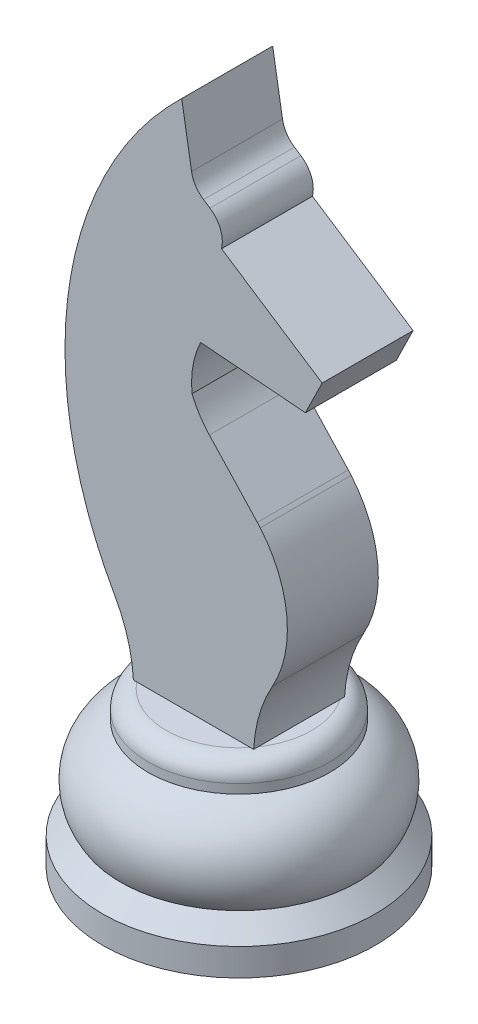
ISO-10303-21;
HEADER;
FILE_DESCRIPTION(('STEP AP214'),'2;1');
FILE_NAME('part.step','',(''),(''),'','','');
FILE_SCHEMA(('AUTOMOTIVE_DESIGN { 1 0 10303 214 1 1 1 1 }'));
ENDSEC;
DATA;
#1=APPLICATION_CONTEXT('core data for automotive mechanical design processes');
#2=APPLICATION_PROTOCOL_DEFINITION('international standard','automotive_design',2000,#1);
#3=PRODUCT_CONTEXT('',#1,'mechanical');
#4=PRODUCT('Part','Part','',(#3));
#5=PRODUCT_RELATED_PRODUCT_CATEGORY('part','',(#4));
#6=PRODUCT_DEFINITION_FORMATION('','',#4);
#7=PRODUCT_DEFINITION_CONTEXT('part definition',#1,'design');
#8=PRODUCT_DEFINITION('design','',#6,#7);
#9=PRODUCT_DEFINITION_SHAPE('','',#8);
#10=(LENGTH_UNIT() NAMED_UNIT(*) SI_UNIT(.MILLI.,.METRE.));
#11=(NAMED_UNIT(*) PLANE_ANGLE_UNIT() SI_UNIT($,.RADIAN.));
#12=(NAMED_UNIT(*) SI_UNIT($,.STERADIAN.) SOLID_ANGLE_UNIT());
#13=UNCERTAINTY_MEASURE_WITH_UNIT(LENGTH_MEASURE(1.E-05),#10,'distance_accuracy_value','');
#14=(GEOMETRIC_REPRESENTATION_CONTEXT(3) GLOBAL_UNCERTAINTY_ASSIGNED_CONTEXT((#13)) GLOBAL_UNIT_ASSIGNED_CONTEXT((#10,
#11,#12)) REPRESENTATION_CONTEXT('',''));
#15=CARTESIAN_POINT('',(0.,0.,0.));
#16=DIRECTION('',(0.,0.,1.));
#17=DIRECTION('',(1.,0.,0.));
#18=AXIS2_PLACEMENT_3D('',#15,#16,#17);
#19=CARTESIAN_POINT('',(-8.,16.97,0.));
#20=DIRECTION('',(0.,-1.,0.));
#21=DIRECTION('',(0.,0.,-1.));
#22=AXIS2_PLACEMENT_3D('',#19,#20,#21);
#23=PLANE('',#22);
#24=DIRECTION('',(0.,0.,-1.));
#25=VECTOR('',#24,1.);
#26=CARTESIAN_POINT('',(-6.61,16.97,5.));
#27=LINE('',#26,#25);
#28=CARTESIAN_POINT('',(-6.61,16.97,-4.50642874125398));
#29=VERTEX_POINT('',#28);
#30=CARTESIAN_POINT('',(-6.61,16.97,4.50642874125398));
#31=VERTEX_POINT('',#30);
#32=EDGE_CURVE('E202',#29,#31,#27,.F.);
#33=ORIENTED_EDGE('',*,*,#32,.F.);
#34=CARTESIAN_POINT('',(0.,16.97,0.));
#35=DIRECTION('',(0.,-1.,0.));
#36=DIRECTION('',(0.,0.,-1.));
#37=AXIS2_PLACEMENT_3D('',#34,#35,#36);
#38=CIRCLE('',#37,8.);
#39=EDGE_CURVE('E373',#31,#29,#38,.T.);
#40=ORIENTED_EDGE('',*,*,#39,.F.);
#41=EDGE_LOOP('',(#33,#40));
#42=FACE_BOUND('',#41,.T.);
#43=ADVANCED_FACE('F38',(#42),#23,.F.);
#44=DIRECTION('',(0.,0.,-1.));
#45=VECTOR('',#44,1.);
#46=CARTESIAN_POINT('',(6.60999999999988,16.97,5.));
#47=LINE('',#46,#45);
#48=CARTESIAN_POINT('',(6.60999999999988,16.97,4.50642874125416));
#49=VERTEX_POINT('',#48);
#50=CARTESIAN_POINT('',(6.60999999999988,16.97,-4.50642874125416));
#51=VERTEX_POINT('',#50);
#52=EDGE_CURVE('E247',#49,#51,#47,.T.);
#53=ORIENTED_EDGE('',*,*,#52,.F.);
#54=EDGE_CURVE('E220',#51,#49,#38,.T.);
#55=ORIENTED_EDGE('',*,*,#54,.F.);
#56=EDGE_LOOP('',(#53,#55));
#57=FACE_BOUND('',#56,.T.);
#58=ADVANCED_FACE('F484',(#57),#23,.F.);
#59=DIRECTION('',(-1.,0.,0.));
#60=VECTOR('',#59,1.);
#61=CARTESIAN_POINT('',(-8.,16.97,-5.));
#62=LINE('',#61,#60);
#63=CARTESIAN_POINT('',(6.2449979983984,16.97,-5.));
#64=VERTEX_POINT('',#63);
#65=CARTESIAN_POINT('',(-6.2449979983984,16.97,-5.));
#66=VERTEX_POINT('',#65);
#67=EDGE_CURVE('E240',#64,#66,#62,.T.);
#68=ORIENTED_EDGE('',*,*,#67,.F.);
#69=EDGE_CURVE('E204',#66,#64,#38,.T.);
#70=ORIENTED_EDGE('',*,*,#69,.F.);
#71=EDGE_LOOP('',(#68,#70));
#72=FACE_BOUND('',#71,.T.);
#73=ADVANCED_FACE('F384',(#72),#23,.F.);
#74=CARTESIAN_POINT('',(0.,0.,0.));
#75=DIRECTION('',(0.,1.,0.));
#76=DIRECTION('',(0.,0.,1.));
#77=AXIS2_PLACEMENT_3D('',#74,#75,#76);
#78=PLANE('',#77);
#79=CARTESIAN_POINT('',(0.,0.,0.));
#80=DIRECTION('',(0.,-1.,0.));
#81=DIRECTION('',(0.,0.,-1.));
#82=AXIS2_PLACEMENT_3D('',#79,#80,#81);
#83=CIRCLE('',#82,15.);
#84=CARTESIAN_POINT('',(0.,0.,-15.));
#85=VERTEX_POINT('',#84);
#86=EDGE_CURVE('E236',#85,#85,#83,.T.);
#87=ORIENTED_EDGE('',*,*,#86,.T.);
#88=EDGE_LOOP('',(#87));
#89=FACE_BOUND('',#88,.T.);
#90=ADVANCED_FACE('F506',(#89),#78,.F.);
#91=CARTESIAN_POINT('',(0.,0.,0.));
#92=DIRECTION('',(0.,-1.,0.));
#93=DIRECTION('',(0.,0.,-1.));
#94=AXIS2_PLACEMENT_3D('',#91,#92,#93);
#95=CYLINDRICAL_SURFACE('',#94,15.);
#96=ORIENTED_EDGE('',*,*,#86,.F.);
#97=EDGE_LOOP('',(#96));
#98=FACE_BOUND('',#97,.T.);
#99=CARTESIAN_POINT('',(0.,3.,0.));
#100=DIRECTION('',(0.,-1.,0.));
#101=DIRECTION('',(0.,0.,-1.));
#102=AXIS2_PLACEMENT_3D('',#99,#100,#101);
#103=CIRCLE('',#102,15.);
#104=CARTESIAN_POINT('',(0.,3.,-15.));
#105=VERTEX_POINT('',#104);
#106=EDGE_CURVE('E232',#105,#105,#103,.T.);
#107=ORIENTED_EDGE('',*,*,#106,.T.);
#108=EDGE_LOOP('',(#107));
#109=FACE_BOUND('',#108,.T.);
#110=ADVANCED_FACE('F510',(#98,#109),#95,.T.);
#111=CARTESIAN_POINT('',(0.,5.,0.));
#112=DIRECTION('',(0.,-1.,0.));
#113=DIRECTION('',(0.,0.,-1.));
#114=AXIS2_PLACEMENT_3D('',#111,#112,#113);
#115=CONICAL_SURFACE('',#114,13.,0.785398163397448);
#116=ORIENTED_EDGE('',*,*,#106,.F.);
#117=EDGE_LOOP('',(#116));
#118=FACE_BOUND('',#117,.T.);
#119=CARTESIAN_POINT('',(0.,5.,0.));
#120=DIRECTION('',(0.,-1.,0.));
#121=DIRECTION('',(0.,0.,-1.));
#122=AXIS2_PLACEMENT_3D('',#119,#120,#121);
#123=CIRCLE('',#122,13.);
#124=CARTESIAN_POINT('',(0.,5.,-13.));
#125=VERTEX_POINT('',#124);
#126=EDGE_CURVE('E228',#125,#125,#123,.T.);
#127=ORIENTED_EDGE('',*,*,#126,.T.);
#128=EDGE_LOOP('',(#127));
#129=FACE_BOUND('',#128,.T.);
#130=ADVANCED_FACE('F516',(#118,#129),#115,.T.);
#131=CARTESIAN_POINT('',(0.,8.31380661428568,0.));
#132=DIRECTION('',(0.,-1.,0.));
#133=DIRECTION('',(0.,0.,-1.));
#134=AXIS2_PLACEMENT_3D('',#131,#132,#133);
#135=TOROIDAL_SURFACE('',#134,7.99813177671418,6.);
#136=ORIENTED_EDGE('',*,*,#126,.F.);
#137=EDGE_LOOP('',(#136));
#138=FACE_BOUND('',#137,.T.);
#139=CARTESIAN_POINT('',(0.,13.97,0.));
#140=DIRECTION('',(0.,-1.,0.));
#141=DIRECTION('',(0.,0.,-1.));
#142=AXIS2_PLACEMENT_3D('',#139,#140,#141);
#143=CIRCLE('',#142,10.);
#144=CARTESIAN_POINT('',(0.,13.97,-10.));
#145=VERTEX_POINT('',#144);
#146=EDGE_CURVE('E224',#145,#145,#143,.T.);
#147=ORIENTED_EDGE('',*,*,#146,.T.);
#148=EDGE_LOOP('',(#147));
#149=FACE_BOUND('',#148,.T.);
#150=ADVANCED_FACE('F708',(#138,#149),#135,.T.);
#151=CARTESIAN_POINT('',(0.,0.,0.));
#152=DIRECTION('',(0.,-1.,0.));
#153=DIRECTION('',(0.,0.,-1.));
#154=AXIS2_PLACEMENT_3D('',#151,#152,#153);
#155=CYLINDRICAL_SURFACE('',#154,10.);
#156=ORIENTED_EDGE('',*,*,#146,.F.);
#157=EDGE_LOOP('',(#156));
#158=FACE_BOUND('',#157,.T.);
#159=CARTESIAN_POINT('',(0.,14.97,0.));
#160=DIRECTION('',(0.,-1.,0.));
#161=DIRECTION('',(0.,0.,-1.));
#162=AXIS2_PLACEMENT_3D('',#159,#160,#161);
#163=CIRCLE('',#162,10.);
#164=CARTESIAN_POINT('',(0.,14.97,-10.));
#165=VERTEX_POINT('',#164);
#166=EDGE_CURVE('E219',#165,#165,#163,.T.);
#167=ORIENTED_EDGE('',*,*,#166,.T.);
#168=EDGE_LOOP('',(#167));
#169=FACE_BOUND('',#168,.T.);
#170=ADVANCED_FACE('F503',(#158,#169),#155,.T.);
#171=CARTESIAN_POINT('',(0.,14.97,0.));
#172=DIRECTION('',(0.,-1.,0.));
#173=DIRECTION('',(0.,0.,-1.));
#174=AXIS2_PLACEMENT_3D('',#171,#172,#173);
#175=TOROIDAL_SURFACE('',#174,8.,2.);
#176=ORIENTED_EDGE('',*,*,#166,.F.);
#177=EDGE_LOOP('',(#176));
#178=FACE_BOUND('',#177,.T.);
#179=EDGE_CURVE('E212',#64,#51,#38,.T.);
#180=ORIENTED_EDGE('',*,*,#179,.T.);
#181=ORIENTED_EDGE('',*,*,#54,.T.);
#182=CARTESIAN_POINT('',(6.2449979983984,16.97,5.));
#183=VERTEX_POINT('',#182);
#184=EDGE_CURVE('E364',#49,#183,#38,.T.);
#185=ORIENTED_EDGE('',*,*,#184,.T.);
#186=CARTESIAN_POINT('',(-6.2449979983984,16.97,5.));
#187=VERTEX_POINT('',#186);
#188=EDGE_CURVE('E369',#183,#187,#38,.T.);
#189=ORIENTED_EDGE('',*,*,#188,.T.);
#190=EDGE_CURVE('E181',#187,#31,#38,.T.);
#191=ORIENTED_EDGE('',*,*,#190,.T.);
#192=ORIENTED_EDGE('',*,*,#39,.T.);
#193=EDGE_CURVE('E210',#29,#66,#38,.T.);
#194=ORIENTED_EDGE('',*,*,#193,.T.);
#195=ORIENTED_EDGE('',*,*,#69,.T.);
#196=EDGE_LOOP('',(#180,#181,#185,#189,#191,#192,#194,#195));
#197=FACE_BOUND('',#196,.T.);
#198=ADVANCED_FACE('F379',(#178,#197),#175,.T.);
#199=ORIENTED_EDGE('',*,*,#188,.F.);
#200=DIRECTION('',(-1.,0.,0.));
#201=VECTOR('',#200,1.);
#202=CARTESIAN_POINT('',(-8.,16.97,5.));
#203=LINE('',#202,#201);
#204=EDGE_CURVE('E244',#183,#187,#203,.T.);
#205=ORIENTED_EDGE('',*,*,#204,.T.);
#206=EDGE_LOOP('',(#199,#205));
#207=FACE_BOUND('',#206,.T.);
#208=ADVANCED_FACE('F487',(#207),#23,.F.);
#209=CARTESIAN_POINT('',(-6.61,16.97,5.));
#210=DIRECTION('',(0.,1.,0.));
#211=DIRECTION('',(-1.,0.,0.));
#212=AXIS2_PLACEMENT_3D('',#209,#210,#211);
#213=PLANE('',#212);
#214=ORIENTED_EDGE('',*,*,#179,.F.);
#215=DIRECTION('',(1.,0.,0.));
#216=VECTOR('',#215,1.);
#217=CARTESIAN_POINT('',(-6.61,16.97,-5.));
#218=LINE('',#217,#216);
#219=CARTESIAN_POINT('',(6.60999999999988,16.97,-5.));
#220=VERTEX_POINT('',#219);
#221=EDGE_CURVE('E390',#64,#220,#218,.T.);
#222=ORIENTED_EDGE('',*,*,#221,.T.);
#223=DIRECTION('',(0.,0.,-1.));
#224=VECTOR('',#223,1.);
#225=CARTESIAN_POINT('',(6.60999999999988,16.97,5.));
#226=LINE('',#225,#224);
#227=EDGE_CURVE('E344',#51,#220,#226,.T.);
#228=ORIENTED_EDGE('',*,*,#227,.F.);
#229=EDGE_LOOP('',(#214,#222,#228));
#230=FACE_BOUND('',#229,.T.);
#231=ADVANCED_FACE('F495',(#230),#213,.F.);
#232=ORIENTED_EDGE('',*,*,#184,.F.);
#233=CARTESIAN_POINT('',(6.60999999999988,16.97,5.));
#234=VERTEX_POINT('',#233);
#235=EDGE_CURVE('E213',#234,#49,#226,.T.);
#236=ORIENTED_EDGE('',*,*,#235,.F.);
#237=DIRECTION('',(1.,0.,0.));
#238=VECTOR('',#237,1.);
#239=CARTESIAN_POINT('',(-6.61,16.97,5.));
#240=LINE('',#239,#238);
#241=EDGE_CURVE('E185',#183,#234,#240,.T.);
#242=ORIENTED_EDGE('',*,*,#241,.F.);
#243=EDGE_LOOP('',(#232,#236,#242));
#244=FACE_BOUND('',#243,.T.);
#245=ADVANCED_FACE('F362',(#244),#213,.F.);
#246=ORIENTED_EDGE('',*,*,#190,.F.);
#247=CARTESIAN_POINT('',(-6.61,16.97,5.));
#248=VERTEX_POINT('',#247);
#249=EDGE_CURVE('E175',#248,#187,#240,.T.);
#250=ORIENTED_EDGE('',*,*,#249,.F.);
#251=DIRECTION('',(0.,0.,-1.));
#252=VECTOR('',#251,1.);
#253=CARTESIAN_POINT('',(-6.61,16.97,5.));
#254=LINE('',#253,#252);
#255=EDGE_CURVE('E179',#248,#31,#254,.T.);
#256=ORIENTED_EDGE('',*,*,#255,.T.);
#257=EDGE_LOOP('',(#246,#250,#256));
#258=FACE_BOUND('',#257,.T.);
#259=ADVANCED_FACE('F177',(#258),#213,.F.);
#260=CARTESIAN_POINT('',(-22.6266432968998,16.1047038080094,5.));
#261=DIRECTION('',(0.,0.,-1.));
#262=DIRECTION('',(-1.,0.,0.));
#263=AXIS2_PLACEMENT_3D('',#260,#261,#262);
#264=CYLINDRICAL_SURFACE('',#263,16.04);
#265=CARTESIAN_POINT('',(-22.6266432968998,16.1047038080094,-5.));
#266=DIRECTION('',(0.,0.,-1.));
#267=DIRECTION('',(1.,0.,0.));
#268=AXIS2_PLACEMENT_3D('',#265,#266,#267);
#269=CIRCLE('',#268,16.04);
#270=CARTESIAN_POINT('',(-8.67,24.01,-5.));
#271=VERTEX_POINT('',#270);
#272=CARTESIAN_POINT('',(-6.61,16.97,-5.));
#273=VERTEX_POINT('',#272);
#274=EDGE_CURVE('E301',#271,#273,#269,.T.);
#275=ORIENTED_EDGE('',*,*,#274,.T.);
#276=EDGE_CURVE('E205',#29,#273,#254,.T.);
#277=ORIENTED_EDGE('',*,*,#276,.F.);
#278=ORIENTED_EDGE('',*,*,#32,.T.);
#279=ORIENTED_EDGE('',*,*,#255,.F.);
#280=CARTESIAN_POINT('',(-22.6266432968998,16.1047038080094,5.));
#281=DIRECTION('',(0.,0.,-1.));
#282=DIRECTION('',(1.,0.,0.));
#283=AXIS2_PLACEMENT_3D('',#280,#281,#282);
#284=CIRCLE('',#283,16.04);
#285=CARTESIAN_POINT('',(-8.67,24.01,5.));
#286=VERTEX_POINT('',#285);
#287=EDGE_CURVE('E188',#286,#248,#284,.T.);
#288=ORIENTED_EDGE('',*,*,#287,.F.);
#289=DIRECTION('',(0.,0.,-1.));
#290=VECTOR('',#289,1.);
#291=CARTESIAN_POINT('',(-8.67,24.01,5.));
#292=LINE('',#291,#290);
#293=EDGE_CURVE('E331',#286,#271,#292,.T.);
#294=ORIENTED_EDGE('',*,*,#293,.T.);
#295=EDGE_LOOP('',(#275,#277,#278,#279,#288,#294));
#296=FACE_BOUND('',#295,.T.);
#297=ADVANCED_FACE('F200',(#296),#264,.F.);
#298=ORIENTED_EDGE('',*,*,#193,.F.);
#299=ORIENTED_EDGE('',*,*,#276,.T.);
#300=EDGE_CURVE('E388',#273,#66,#218,.T.);
#301=ORIENTED_EDGE('',*,*,#300,.T.);
#302=EDGE_LOOP('',(#298,#299,#301));
#303=FACE_BOUND('',#302,.T.);
#304=ADVANCED_FACE('F391',(#303),#213,.F.);
#305=CARTESIAN_POINT('',(22.6266432968997,16.1047038080096,5.));
#306=DIRECTION('',(0.,0.,-1.));
#307=DIRECTION('',(-1.,0.,0.));
#308=AXIS2_PLACEMENT_3D('',#305,#306,#307);
#309=CYLINDRICAL_SURFACE('',#308,16.04);
#310=CARTESIAN_POINT('',(22.6266432968997,16.1047038080096,-5.));
#311=DIRECTION('',(0.,0.,-1.));
#312=DIRECTION('',(-1.,0.,0.));
#313=AXIS2_PLACEMENT_3D('',#310,#311,#312);
#314=CIRCLE('',#313,16.04);
#315=CARTESIAN_POINT('',(8.66999999999983,24.0100000000001,-5.));
#316=VERTEX_POINT('',#315);
#317=EDGE_CURVE('E393',#220,#316,#314,.T.);
#318=ORIENTED_EDGE('',*,*,#317,.T.);
#319=DIRECTION('',(0.,0.,-1.));
#320=VECTOR('',#319,1.);
#321=CARTESIAN_POINT('',(8.66999999999983,24.0100000000001,5.));
#322=LINE('',#321,#320);
#323=CARTESIAN_POINT('',(8.66999999999983,24.0100000000001,5.));
#324=VERTEX_POINT('',#323);
#325=EDGE_CURVE('E341',#324,#316,#322,.T.);
#326=ORIENTED_EDGE('',*,*,#325,.F.);
#327=CARTESIAN_POINT('',(22.6266432968997,16.1047038080096,5.));
#328=DIRECTION('',(0.,0.,-1.));
#329=DIRECTION('',(-1.,0.,0.));
#330=AXIS2_PLACEMENT_3D('',#327,#328,#329);
#331=CIRCLE('',#330,16.04);
#332=EDGE_CURVE('E184',#234,#324,#331,.T.);
#333=ORIENTED_EDGE('',*,*,#332,.F.);
#334=ORIENTED_EDGE('',*,*,#235,.T.);
#335=ORIENTED_EDGE('',*,*,#52,.T.);
#336=ORIENTED_EDGE('',*,*,#227,.T.);
#337=EDGE_LOOP('',(#318,#326,#333,#334,#335,#336));
#338=FACE_BOUND('',#337,.T.);
#339=ADVANCED_FACE('F358',(#338),#309,.F.);
#340=CARTESIAN_POINT('',(-2.36195303089741,30.2612728563128,5.));
#341=DIRECTION('',(0.,0.,-1.));
#342=DIRECTION('',(-1.,0.,0.));
#343=AXIS2_PLACEMENT_3D('',#340,#341,#342);
#344=CYLINDRICAL_SURFACE('',#343,12.6799999999999);
#345=CARTESIAN_POINT('',(-2.36195303089741,30.2612728563128,-5.));
#346=DIRECTION('',(0.,0.,1.));
#347=DIRECTION('',(-1.,0.,0.));
#348=AXIS2_PLACEMENT_3D('',#345,#346,#347);
#349=CIRCLE('',#348,12.6799999999999);
#350=CARTESIAN_POINT('',(7.3359892790115,38.4302577965411,-5.));
#351=VERTEX_POINT('',#350);
#352=EDGE_CURVE('E397',#316,#351,#349,.T.);
#353=ORIENTED_EDGE('',*,*,#352,.T.);
#354=DIRECTION('',(0.,0.,-1.));
#355=VECTOR('',#354,1.);
#356=CARTESIAN_POINT('',(7.3359892790115,38.4302577965411,5.));
#357=LINE('',#356,#355);
#358=CARTESIAN_POINT('',(7.3359892790115,38.4302577965411,5.));
#359=VERTEX_POINT('',#358);
#360=EDGE_CURVE('E278',#351,#359,#357,.F.);
#361=ORIENTED_EDGE('',*,*,#360,.T.);
#362=CARTESIAN_POINT('',(-2.36195303089741,30.2612728563128,5.));
#363=DIRECTION('',(0.,0.,1.));
#364=DIRECTION('',(-1.,0.,0.));
#365=AXIS2_PLACEMENT_3D('',#362,#363,#364);
#366=CIRCLE('',#365,12.6799999999999);
#367=EDGE_CURVE('E441',#324,#359,#366,.T.);
#368=ORIENTED_EDGE('',*,*,#367,.F.);
#369=ORIENTED_EDGE('',*,*,#325,.T.);
#370=EDGE_LOOP('',(#353,#361,#368,#369));
#371=FACE_BOUND('',#370,.T.);
#372=ADVANCED_FACE('F447',(#371),#344,.T.);
#373=CARTESIAN_POINT('',(0.,46.35,5.));
#374=DIRECTION('',(-0.732895581670668,-0.680341139699499,0.));
#375=DIRECTION('',(0.680341139699499,-0.732895581670668,0.));
#376=AXIS2_PLACEMENT_3D('',#373,#374,#375);
#377=PLANE('',#376);
#378=DIRECTION('',(-0.680341139699499,0.732895581670668,0.));
#379=VECTOR('',#378,1.);
#380=CARTESIAN_POINT('',(0.,46.35,-5.));
#381=LINE('',#380,#379);
#382=CARTESIAN_POINT('',(7.01672560840826,38.7912520482456,-5.));
#383=VERTEX_POINT('',#382);
#384=CARTESIAN_POINT('',(1.74253125192974,44.4728631036094,-5.));
#385=VERTEX_POINT('',#384);
#386=EDGE_CURVE('E404',#383,#385,#381,.T.);
#387=ORIENTED_EDGE('',*,*,#386,.T.);
#388=DIRECTION('',(0.,0.,-1.));
#389=VECTOR('',#388,1.);
#390=CARTESIAN_POINT('',(1.74253125192974,44.4728631036094,5.));
#391=LINE('',#390,#389);
#392=CARTESIAN_POINT('',(1.74253125192974,44.4728631036094,5.));
#393=VERTEX_POINT('',#392);
#394=EDGE_CURVE('E272',#385,#393,#391,.F.);
#395=ORIENTED_EDGE('',*,*,#394,.T.);
#396=DIRECTION('',(-0.680341139699499,0.732895581670668,0.));
#397=VECTOR('',#396,1.);
#398=CARTESIAN_POINT('',(0.,46.35,5.));
#399=LINE('',#398,#397);
#400=CARTESIAN_POINT('',(7.01672560840826,38.7912520482456,5.));
#401=VERTEX_POINT('',#400);
#402=EDGE_CURVE('E437',#401,#393,#399,.T.);
#403=ORIENTED_EDGE('',*,*,#402,.F.);
#404=DIRECTION('',(0.,0.,-1.));
#405=VECTOR('',#404,1.);
#406=CARTESIAN_POINT('',(7.01672560840826,38.7912520482456,5.));
#407=LINE('',#406,#405);
#408=EDGE_CURVE('E268',#401,#383,#407,.T.);
#409=ORIENTED_EDGE('',*,*,#408,.T.);
#410=EDGE_LOOP('',(#387,#395,#403,#409));
#411=FACE_BOUND('',#410,.T.);
#412=ADVANCED_FACE('F455',(#411),#377,.F.);
#413=CARTESIAN_POINT('',(12.3,51.87,5.));
#414=DIRECTION('',(0.0813269296982187,0.996687478854762,0.));
#415=DIRECTION('',(-0.996687478854762,0.0813269296982187,0.));
#416=AXIS2_PLACEMENT_3D('',#413,#414,#415);
#417=PLANE('',#416);
#418=DIRECTION('',(0.996687478854762,-0.0813269296982187,0.));
#419=VECTOR('',#418,1.);
#420=CARTESIAN_POINT('',(12.3,51.87,-5.));
#421=LINE('',#420,#419);
#422=CARTESIAN_POINT('',(0.78,52.81,-5.));
#423=VERTEX_POINT('',#422);
#424=CARTESIAN_POINT('',(12.3,51.87,-5.));
#425=VERTEX_POINT('',#424);
#426=EDGE_CURVE('E408',#423,#425,#421,.T.);
#427=ORIENTED_EDGE('',*,*,#426,.T.);
#428=DIRECTION('',(0.,0.,-1.));
#429=VECTOR('',#428,1.);
#430=CARTESIAN_POINT('',(12.3,51.87,5.));
#431=LINE('',#430,#429);
#432=CARTESIAN_POINT('',(12.3,51.87,5.));
#433=VERTEX_POINT('',#432);
#434=EDGE_CURVE('E328',#433,#425,#431,.T.);
#435=ORIENTED_EDGE('',*,*,#434,.F.);
#436=DIRECTION('',(0.996687478854762,-0.0813269296982187,0.));
#437=VECTOR('',#436,1.);
#438=CARTESIAN_POINT('',(12.3,51.87,5.));
#439=LINE('',#438,#437);
#440=CARTESIAN_POINT('',(0.78,52.81,5.));
#441=VERTEX_POINT('',#440);
#442=EDGE_CURVE('E434',#441,#433,#439,.T.);
#443=ORIENTED_EDGE('',*,*,#442,.F.);
#444=DIRECTION('',(0.,0.,-1.));
#445=VECTOR('',#444,1.);
#446=CARTESIAN_POINT('',(0.78,52.81,5.));
#447=LINE('',#446,#445);
#448=EDGE_CURVE('E338',#441,#423,#447,.T.);
#449=ORIENTED_EDGE('',*,*,#448,.T.);
#450=EDGE_LOOP('',(#427,#435,#443,#449));
#451=FACE_BOUND('',#450,.T.);
#452=ADVANCED_FACE('F468',(#451),#417,.F.);
#453=CARTESIAN_POINT('',(14.14,55.62,5.));
#454=DIRECTION('',(-0.897753685952581,0.440497808574067,0.));
#455=DIRECTION('',(-0.440497808574067,-0.897753685952581,0.));
#456=AXIS2_PLACEMENT_3D('',#453,#454,#455);
#457=PLANE('',#456);
#458=DIRECTION('',(0.440497808574067,0.897753685952581,0.));
#459=VECTOR('',#458,1.);
#460=CARTESIAN_POINT('',(14.14,55.62,-5.));
#461=LINE('',#460,#459);
#462=CARTESIAN_POINT('',(14.14,55.62,-5.));
#463=VERTEX_POINT('',#462);
#464=EDGE_CURVE('E321',#425,#463,#461,.T.);
#465=ORIENTED_EDGE('',*,*,#464,.T.);
#466=DIRECTION('',(0.,0.,-1.));
#467=VECTOR('',#466,1.);
#468=CARTESIAN_POINT('',(14.14,55.62,5.));
#469=LINE('',#468,#467);
#470=CARTESIAN_POINT('',(14.14,55.62,5.));
#471=VERTEX_POINT('',#470);
#472=EDGE_CURVE('E319',#471,#463,#469,.T.);
#473=ORIENTED_EDGE('',*,*,#472,.F.);
#474=DIRECTION('',(0.440497808574067,0.897753685952581,0.));
#475=VECTOR('',#474,1.);
#476=CARTESIAN_POINT('',(14.14,55.62,5.));
#477=LINE('',#476,#475);
#478=EDGE_CURVE('E431',#433,#471,#477,.T.);
#479=ORIENTED_EDGE('',*,*,#478,.F.);
#480=ORIENTED_EDGE('',*,*,#434,.T.);
#481=EDGE_LOOP('',(#465,#473,#479,#480));
#482=FACE_BOUND('',#481,.T.);
#483=ADVANCED_FACE('F473',(#482),#457,.F.);
#484=CARTESIAN_POINT('',(3.08,62.88,5.));
#485=DIRECTION('',(-0.548755499356447,-0.835982895713816,0.));
#486=DIRECTION('',(0.835982895713816,-0.548755499356447,0.));
#487=AXIS2_PLACEMENT_3D('',#484,#485,#486);
#488=PLANE('',#487);
#489=DIRECTION('',(-0.835982895713816,0.548755499356447,0.));
#490=VECTOR('',#489,1.);
#491=CARTESIAN_POINT('',(3.08,62.88,-5.));
#492=LINE('',#491,#490);
#493=CARTESIAN_POINT('',(3.08,62.88,-5.));
#494=VERTEX_POINT('',#493);
#495=EDGE_CURVE('E310',#463,#494,#492,.T.);
#496=ORIENTED_EDGE('',*,*,#495,.T.);
#497=DIRECTION('',(0.,0.,-1.));
#498=VECTOR('',#497,1.);
#499=CARTESIAN_POINT('',(3.08,62.88,5.));
#500=LINE('',#499,#498);
#501=CARTESIAN_POINT('',(3.08,62.88,5.));
#502=VERTEX_POINT('',#501);
#503=EDGE_CURVE('E317',#502,#494,#500,.T.);
#504=ORIENTED_EDGE('',*,*,#503,.F.);
#505=DIRECTION('',(-0.835982895713816,0.548755499356447,0.));
#506=VECTOR('',#505,1.);
#507=CARTESIAN_POINT('',(3.08,62.88,5.));
#508=LINE('',#507,#506);
#509=EDGE_CURVE('E428',#471,#502,#508,.T.);
#510=ORIENTED_EDGE('',*,*,#509,.F.);
#511=ORIENTED_EDGE('',*,*,#472,.T.);
#512=EDGE_LOOP('',(#496,#504,#510,#511));
#513=FACE_BOUND('',#512,.T.);
#514=ADVANCED_FACE('F315',(#513),#488,.F.);
#515=CARTESIAN_POINT('',(0.,67.29,5.));
#516=DIRECTION('',(-0.54681755660123,-0.837251789960858,0.));
#517=DIRECTION('',(0.837251789960858,-0.54681755660123,0.));
#518=AXIS2_PLACEMENT_3D('',#515,#516,#517);
#519=PLANE('',#518);
#520=DIRECTION('',(-0.837251789960858,0.54681755660123,0.));
#521=VECTOR('',#520,1.);
#522=CARTESIAN_POINT('',(0.,67.29,5.));
#523=LINE('',#522,#521);
#524=CARTESIAN_POINT('',(1.80756738703669,66.109459577366,5.));
#525=VERTEX_POINT('',#524);
#526=CARTESIAN_POINT('',(1.10029367005231,66.5713871485065,5.));
#527=VERTEX_POINT('',#526);
#528=EDGE_CURVE('E423',#525,#527,#523,.T.);
#529=ORIENTED_EDGE('',*,*,#528,.F.);
#530=DIRECTION('',(0.,0.,1.));
#531=VECTOR('',#530,1.);
#532=CARTESIAN_POINT('',(1.80756738703669,66.109459577366,5.));
#533=LINE('',#532,#531);
#534=CARTESIAN_POINT('',(1.80756738703669,66.109459577366,-5.));
#535=VERTEX_POINT('',#534);
#536=EDGE_CURVE('E296',#525,#535,#533,.F.);
#537=ORIENTED_EDGE('',*,*,#536,.T.);
#538=DIRECTION('',(-0.837251789960858,0.54681755660123,0.));
#539=VECTOR('',#538,1.);
#540=CARTESIAN_POINT('',(0.,67.29,-5.));
#541=LINE('',#540,#539);
#542=CARTESIAN_POINT('',(1.10029367005231,66.5713871485065,-5.));
#543=VERTEX_POINT('',#542);
#544=EDGE_CURVE('E311',#535,#543,#541,.T.);
#545=ORIENTED_EDGE('',*,*,#544,.T.);
#546=DIRECTION('',(0.,0.,-1.));
#547=VECTOR('',#546,1.);
#548=CARTESIAN_POINT('',(1.10029367005231,66.5713871485065,5.));
#549=LINE('',#548,#547);
#550=EDGE_CURVE('E257',#543,#527,#549,.F.);
#551=ORIENTED_EDGE('',*,*,#550,.T.);
#552=EDGE_LOOP('',(#529,#537,#545,#551));
#553=FACE_BOUND('',#552,.T.);
#554=ADVANCED_FACE('F480',(#553),#519,.F.);
#555=CARTESIAN_POINT('',(-1.29556040883868,75.,5.));
#556=DIRECTION('',(-0.986174005255483,-0.165713099537598,0.));
#557=DIRECTION('',(0.165713099537598,-0.986174005255483,0.));
#558=AXIS2_PLACEMENT_3D('',#555,#556,#557);
#559=PLANE('',#558);
#560=DIRECTION('',(-0.165713099537598,0.986174005255483,0.));
#561=VECTOR('',#560,1.);
#562=CARTESIAN_POINT('',(-1.29556040883868,75.,5.));
#563=LINE('',#562,#561);
#564=CARTESIAN_POINT('',(-0.217775675910456,68.5860032197763,5.));
#565=VERTEX_POINT('',#564);
#566=CARTESIAN_POINT('',(-1.29556040883868,75.,5.));
#567=VERTEX_POINT('',#566);
#568=EDGE_CURVE('E421',#565,#567,#563,.T.);
#569=ORIENTED_EDGE('',*,*,#568,.F.);
#570=DIRECTION('',(0.,0.,-1.));
#571=VECTOR('',#570,1.);
#572=CARTESIAN_POINT('',(-0.217775675910458,68.5860032197763,-5.));
#573=LINE('',#572,#571);
#574=CARTESIAN_POINT('',(-0.217775675910456,68.5860032197763,-5.));
#575=VERTEX_POINT('',#574);
#576=EDGE_CURVE('E253',#565,#575,#573,.T.);
#577=ORIENTED_EDGE('',*,*,#576,.T.);
#578=DIRECTION('',(-0.165713099537598,0.986174005255483,0.));
#579=VECTOR('',#578,1.);
#580=CARTESIAN_POINT('',(-1.29556040883868,75.,-5.));
#581=LINE('',#580,#579);
#582=CARTESIAN_POINT('',(-1.29556040883868,75.,-5.));
#583=VERTEX_POINT('',#582);
#584=EDGE_CURVE('E415',#575,#583,#581,.T.);
#585=ORIENTED_EDGE('',*,*,#584,.T.);
#586=DIRECTION('',(0.,0.,-1.));
#587=VECTOR('',#586,1.);
#588=CARTESIAN_POINT('',(-1.29556040883868,75.,5.));
#589=LINE('',#588,#587);
#590=EDGE_CURVE('E324',#567,#583,#589,.T.);
#591=ORIENTED_EDGE('',*,*,#590,.F.);
#592=EDGE_LOOP('',(#569,#577,#585,#591));
#593=FACE_BOUND('',#592,.T.);
#594=ADVANCED_FACE('F564',(#593),#559,.F.);
#595=CARTESIAN_POINT('',(27.9357346322055,44.7441527928331,5.));
#596=DIRECTION('',(0.,0.,-1.));
#597=DIRECTION('',(-1.,0.,0.));
#598=AXIS2_PLACEMENT_3D('',#595,#596,#597);
#599=CYLINDRICAL_SURFACE('',#598,42.07);
#600=CARTESIAN_POINT('',(27.9357346322055,44.7441527928331,-5.));
#601=DIRECTION('',(0.,0.,1.));
#602=DIRECTION('',(-1.,0.,0.));
#603=AXIS2_PLACEMENT_3D('',#600,#601,#602);
#604=CIRCLE('',#603,42.07);
#605=EDGE_CURVE('E196',#583,#271,#604,.T.);
#606=ORIENTED_EDGE('',*,*,#605,.T.);
#607=ORIENTED_EDGE('',*,*,#293,.F.);
#608=CARTESIAN_POINT('',(27.9357346322055,44.7441527928331,5.));
#609=DIRECTION('',(0.,0.,1.));
#610=DIRECTION('',(-1.,0.,0.));
#611=AXIS2_PLACEMENT_3D('',#608,#609,#610);
#612=CIRCLE('',#611,42.07);
#613=EDGE_CURVE('E191',#567,#286,#612,.T.);
#614=ORIENTED_EDGE('',*,*,#613,.F.);
#615=ORIENTED_EDGE('',*,*,#590,.T.);
#616=EDGE_LOOP('',(#606,#607,#614,#615));
#617=FACE_BOUND('',#616,.T.);
#618=ADVANCED_FACE('F553',(#617),#599,.T.);
#619=CARTESIAN_POINT('',(-22.6266432968998,16.1047038080094,5.));
#620=DIRECTION('',(0.,0.,1.));
#621=DIRECTION('',(1.,0.,0.));
#622=AXIS2_PLACEMENT_3D('',#619,#620,#621);
#623=PLANE('',#622);
#624=ORIENTED_EDGE('',*,*,#509,.T.);
#625=CARTESIAN_POINT('',(0.167114717233001,63.5977042074834,5.));
#626=DIRECTION('',(0.,0.,1.));
#627=DIRECTION('',(1.,0.,0.));
#628=AXIS2_PLACEMENT_3D('',#625,#626,#627);
#629=CIRCLE('',#628,3.);
#630=EDGE_CURVE('E11',#502,#525,#629,.T.);
#631=ORIENTED_EDGE('',*,*,#630,.T.);
#632=ORIENTED_EDGE('',*,*,#528,.T.);
#633=CARTESIAN_POINT('',(2.74074633985599,69.0831425183891,5.));
#634=DIRECTION('',(0.,0.,1.));
#635=DIRECTION('',(1.,0.,0.));
#636=AXIS2_PLACEMENT_3D('',#633,#634,#635);
#637=CIRCLE('',#636,3.);
#638=EDGE_CURVE('E265',#527,#565,#637,.F.);
#639=ORIENTED_EDGE('',*,*,#638,.T.);
#640=ORIENTED_EDGE('',*,*,#568,.T.);
#641=ORIENTED_EDGE('',*,*,#613,.T.);
#642=ORIENTED_EDGE('',*,*,#287,.T.);
#643=ORIENTED_EDGE('',*,*,#249,.T.);
#644=ORIENTED_EDGE('',*,*,#204,.F.);
#645=ORIENTED_EDGE('',*,*,#241,.T.);
#646=ORIENTED_EDGE('',*,*,#332,.T.);
#647=ORIENTED_EDGE('',*,*,#367,.T.);
#648=CARTESIAN_POINT('',(-0.312230208298423,31.9878406512506,5.));
#649=DIRECTION('',(0.,0.,1.));
#650=DIRECTION('',(1.,0.,0.));
#651=AXIS2_PLACEMENT_3D('',#648,#649,#650);
#652=CIRCLE('',#651,10.);
#653=EDGE_CURVE('E281',#359,#401,#652,.T.);
#654=ORIENTED_EDGE('',*,*,#653,.T.);
#655=ORIENTED_EDGE('',*,*,#402,.T.);
#656=CARTESIAN_POINT('',(9.07148706863643,51.2762745006044,5.));
#657=DIRECTION('',(0.,0.,1.));
#658=DIRECTION('',(1.,0.,0.));
#659=AXIS2_PLACEMENT_3D('',#656,#657,#658);
#660=CIRCLE('',#659,10.);
#661=CARTESIAN_POINT('',(-0.167203870802131,47.4491881773637,5.));
#662=VERTEX_POINT('',#661);
#663=EDGE_CURVE('E293',#393,#662,#660,.F.);
#664=ORIENTED_EDGE('',*,*,#663,.T.);
#665=CARTESIAN_POINT('',(9.78205055434745,48.4553374623316,5.));
#666=DIRECTION('',(0.,0.,1.));
#667=DIRECTION('',(1.,0.,0.));
#668=AXIS2_PLACEMENT_3D('',#665,#666,#667);
#669=CIRCLE('',#668,10.);
#670=EDGE_CURVE('E287',#662,#441,#669,.F.);
#671=ORIENTED_EDGE('',*,*,#670,.T.);
#672=ORIENTED_EDGE('',*,*,#442,.T.);
#673=ORIENTED_EDGE('',*,*,#478,.T.);
#674=EDGE_LOOP('',(#624,#631,#632,#639,#640,#641,#642,#643,#644,#645,#646,#647,#654,#655,#664,
#671,#672,#673));
#675=FACE_BOUND('',#674,.T.);
#676=ADVANCED_FACE('F189',(#675),#623,.T.);
#677=CARTESIAN_POINT('',(-22.6266432968998,16.1047038080094,-5.));
#678=DIRECTION('',(0.,0.,1.));
#679=DIRECTION('',(1.,0.,0.));
#680=AXIS2_PLACEMENT_3D('',#677,#678,#679);
#681=PLANE('',#680);
#682=ORIENTED_EDGE('',*,*,#544,.F.);
#683=CARTESIAN_POINT('',(0.167114717233001,63.5977042074834,-5.));
#684=DIRECTION('',(0.,0.,1.));
#685=DIRECTION('',(1.,0.,0.));
#686=AXIS2_PLACEMENT_3D('',#683,#684,#685);
#687=CIRCLE('',#686,3.);
#688=EDGE_CURVE('E47',#535,#494,#687,.F.);
#689=ORIENTED_EDGE('',*,*,#688,.T.);
#690=ORIENTED_EDGE('',*,*,#495,.F.);
#691=ORIENTED_EDGE('',*,*,#464,.F.);
#692=ORIENTED_EDGE('',*,*,#426,.F.);
#693=CARTESIAN_POINT('',(9.78205055434745,48.4553374623316,-5.));
#694=DIRECTION('',(0.,0.,1.));
#695=DIRECTION('',(1.,0.,0.));
#696=AXIS2_PLACEMENT_3D('',#693,#694,#695);
#697=CIRCLE('',#696,10.);
#698=CARTESIAN_POINT('',(-0.167203870802131,47.4491881773637,-5.));
#699=VERTEX_POINT('',#698);
#700=EDGE_CURVE('E284',#423,#699,#697,.T.);
#701=ORIENTED_EDGE('',*,*,#700,.T.);
#702=CARTESIAN_POINT('',(9.07148706863643,51.2762745006044,-5.));
#703=DIRECTION('',(0.,0.,1.));
#704=DIRECTION('',(1.,0.,0.));
#705=AXIS2_PLACEMENT_3D('',#702,#703,#704);
#706=CIRCLE('',#705,10.);
#707=EDGE_CURVE('E290',#699,#385,#706,.T.);
#708=ORIENTED_EDGE('',*,*,#707,.T.);
#709=ORIENTED_EDGE('',*,*,#386,.F.);
#710=CARTESIAN_POINT('',(-0.312230208298423,31.9878406512506,-5.));
#711=DIRECTION('',(0.,0.,1.));
#712=DIRECTION('',(1.,0.,0.));
#713=AXIS2_PLACEMENT_3D('',#710,#711,#712);
#714=CIRCLE('',#713,10.);
#715=EDGE_CURVE('E275',#383,#351,#714,.F.);
#716=ORIENTED_EDGE('',*,*,#715,.T.);
#717=ORIENTED_EDGE('',*,*,#352,.F.);
#718=ORIENTED_EDGE('',*,*,#317,.F.);
#719=ORIENTED_EDGE('',*,*,#221,.F.);
#720=ORIENTED_EDGE('',*,*,#67,.T.);
#721=ORIENTED_EDGE('',*,*,#300,.F.);
#722=ORIENTED_EDGE('',*,*,#274,.F.);
#723=ORIENTED_EDGE('',*,*,#605,.F.);
#724=ORIENTED_EDGE('',*,*,#584,.F.);
#725=CARTESIAN_POINT('',(2.74074633985599,69.0831425183891,-5.));
#726=DIRECTION('',(0.,0.,1.));
#727=DIRECTION('',(1.,0.,0.));
#728=AXIS2_PLACEMENT_3D('',#725,#726,#727);
#729=CIRCLE('',#728,3.);
#730=EDGE_CURVE('E261',#575,#543,#729,.T.);
#731=ORIENTED_EDGE('',*,*,#730,.T.);
#732=EDGE_LOOP('',(#682,#689,#690,#691,#692,#701,#708,#709,#716,#717,#718,#719,#720,#721,#722,
#723,#724,#731));
#733=FACE_BOUND('',#732,.T.);
#734=ADVANCED_FACE('F308',(#733),#681,.F.);
#735=CARTESIAN_POINT('',(2.74074633985599,69.0831425183891,5.));
#736=DIRECTION('',(0.,0.,1.));
#737=DIRECTION('',(1.,0.,0.));
#738=AXIS2_PLACEMENT_3D('',#735,#736,#737);
#739=CYLINDRICAL_SURFACE('',#738,3.);
#740=ORIENTED_EDGE('',*,*,#638,.F.);
#741=ORIENTED_EDGE('',*,*,#550,.F.);
#742=ORIENTED_EDGE('',*,*,#730,.F.);
#743=ORIENTED_EDGE('',*,*,#576,.F.);
#744=EDGE_LOOP('',(#740,#741,#742,#743));
#745=FACE_BOUND('',#744,.T.);
#746=ADVANCED_FACE('F521',(#745),#739,.F.);
#747=CARTESIAN_POINT('',(9.07148706863643,51.2762745006044,5.));
#748=DIRECTION('',(0.,0.,1.));
#749=DIRECTION('',(1.,0.,0.));
#750=AXIS2_PLACEMENT_3D('',#747,#748,#749);
#751=CYLINDRICAL_SURFACE('',#750,10.);
#752=DIRECTION('',(0.,0.,1.));
#753=VECTOR('',#752,1.);
#754=CARTESIAN_POINT('',(-0.167203870802131,47.4491881773637,0.));
#755=LINE('',#754,#753);
#756=EDGE_CURVE('E297',#662,#699,#755,.F.);
#757=ORIENTED_EDGE('',*,*,#756,.F.);
#758=ORIENTED_EDGE('',*,*,#663,.F.);
#759=ORIENTED_EDGE('',*,*,#394,.F.);
#760=ORIENTED_EDGE('',*,*,#707,.F.);
#761=EDGE_LOOP('',(#757,#758,#759,#760));
#762=FACE_BOUND('',#761,.T.);
#763=ADVANCED_FACE('F461',(#762),#751,.F.);
#764=CARTESIAN_POINT('',(9.78205055434745,48.4553374623316,5.));
#765=DIRECTION('',(0.,0.,-1.));
#766=DIRECTION('',(-1.,0.,0.));
#767=AXIS2_PLACEMENT_3D('',#764,#765,#766);
#768=CYLINDRICAL_SURFACE('',#767,10.);
#769=ORIENTED_EDGE('',*,*,#670,.F.);
#770=ORIENTED_EDGE('',*,*,#756,.T.);
#771=ORIENTED_EDGE('',*,*,#700,.F.);
#772=ORIENTED_EDGE('',*,*,#448,.F.);
#773=EDGE_LOOP('',(#769,#770,#771,#772));
#774=FACE_BOUND('',#773,.T.);
#775=ADVANCED_FACE('F471',(#774),#768,.F.);
#776=CARTESIAN_POINT('',(-0.312230208298423,31.9878406512506,5.));
#777=DIRECTION('',(0.,0.,-1.));
#778=DIRECTION('',(-1.,0.,0.));
#779=AXIS2_PLACEMENT_3D('',#776,#777,#778);
#780=CYLINDRICAL_SURFACE('',#779,10.);
#781=ORIENTED_EDGE('',*,*,#653,.F.);
#782=ORIENTED_EDGE('',*,*,#360,.F.);
#783=ORIENTED_EDGE('',*,*,#715,.F.);
#784=ORIENTED_EDGE('',*,*,#408,.F.);
#785=EDGE_LOOP('',(#781,#782,#783,#784));
#786=FACE_BOUND('',#785,.T.);
#787=ADVANCED_FACE('F450',(#786),#780,.T.);
#788=CARTESIAN_POINT('',(0.167114717233001,63.5977042074834,5.));
#789=DIRECTION('',(0.,0.,1.));
#790=DIRECTION('',(1.,0.,0.));
#791=AXIS2_PLACEMENT_3D('',#788,#789,#790);
#792=CYLINDRICAL_SURFACE('',#791,3.);
#793=ORIENTED_EDGE('',*,*,#630,.F.);
#794=ORIENTED_EDGE('',*,*,#503,.T.);
#795=ORIENTED_EDGE('',*,*,#688,.F.);
#796=ORIENTED_EDGE('',*,*,#536,.F.);
#797=EDGE_LOOP('',(#793,#794,#795,#796));
#798=FACE_BOUND('',#797,.T.);
#799=ADVANCED_FACE('F40',(#798),#792,.T.);
#800=CLOSED_SHELL('',(#43,#58,#73,#90,#110,#130,#150,#170,#198,#208,#231,#245,#259,#297,#304,
#339,#372,#412,#452,#483,#514,#554,#594,#618,#676,#734,#746,#763,#775,#787,#799));
#801=MANIFOLD_SOLID_BREP('B2',#800);
#802=ADVANCED_BREP_SHAPE_REPRESENTATION('',(#18,#801),#14);
#803=SHAPE_DEFINITION_REPRESENTATION(#9,#802);
ENDSEC;
END-ISO-10303-21;
